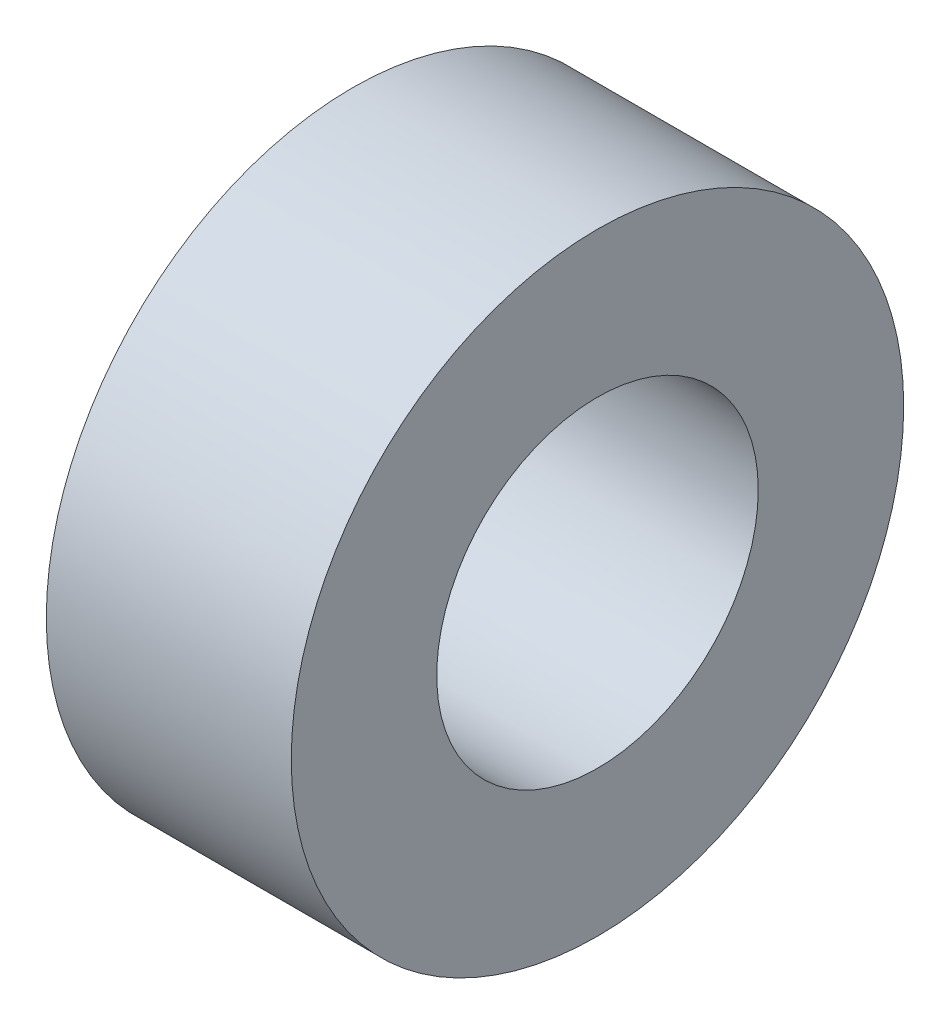
ISO-10303-21;
HEADER;
FILE_DESCRIPTION(('STEP AP214'),'2;1');
FILE_NAME('part.step','',(''),(''),'','','');
FILE_SCHEMA(('AUTOMOTIVE_DESIGN { 1 0 10303 214 1 1 1 1 }'));
ENDSEC;
DATA;
#1=APPLICATION_CONTEXT('core data for automotive mechanical design processes');
#2=APPLICATION_PROTOCOL_DEFINITION('international standard','automotive_design',2000,#1);
#3=PRODUCT_CONTEXT('',#1,'mechanical');
#4=PRODUCT('Part','Part','',(#3));
#5=PRODUCT_RELATED_PRODUCT_CATEGORY('part','',(#4));
#6=PRODUCT_DEFINITION_FORMATION('','',#4);
#7=PRODUCT_DEFINITION_CONTEXT('part definition',#1,'design');
#8=PRODUCT_DEFINITION('design','',#6,#7);
#9=PRODUCT_DEFINITION_SHAPE('','',#8);
#10=(LENGTH_UNIT() NAMED_UNIT(*) SI_UNIT(.MILLI.,.METRE.));
#11=(NAMED_UNIT(*) PLANE_ANGLE_UNIT() SI_UNIT($,.RADIAN.));
#12=(NAMED_UNIT(*) SI_UNIT($,.STERADIAN.) SOLID_ANGLE_UNIT());
#13=UNCERTAINTY_MEASURE_WITH_UNIT(LENGTH_MEASURE(1.E-05),#10,'distance_accuracy_value','');
#14=(GEOMETRIC_REPRESENTATION_CONTEXT(3) GLOBAL_UNCERTAINTY_ASSIGNED_CONTEXT((#13)) GLOBAL_UNIT_ASSIGNED_CONTEXT((#10,
#11,#12)) REPRESENTATION_CONTEXT('',''));
#15=CARTESIAN_POINT('',(0.,0.,0.));
#16=DIRECTION('',(0.,0.,1.));
#17=DIRECTION('',(1.,0.,0.));
#18=AXIS2_PLACEMENT_3D('',#15,#16,#17);
#19=CARTESIAN_POINT('',(0.,0.,-10.));
#20=DIRECTION('',(1.,0.,0.));
#21=DIRECTION('',(0.,0.,-1.));
#22=AXIS2_PLACEMENT_3D('',#19,#20,#21);
#23=PLANE('',#22);
#24=CARTESIAN_POINT('',(0.,0.,-10.));
#25=DIRECTION('',(1.,0.,0.));
#26=DIRECTION('',(0.,0.,-1.));
#27=AXIS2_PLACEMENT_3D('',#24,#25,#26);
#28=CIRCLE('',#27,5.25);
#29=CARTESIAN_POINT('',(0.,0.,-15.25));
#30=VERTEX_POINT('',#29);
#31=EDGE_CURVE('E46',#30,#30,#28,.T.);
#32=ORIENTED_EDGE('',*,*,#31,.T.);
#33=EDGE_LOOP('',(#32));
#34=FACE_BOUND('',#33,.T.);
#35=CARTESIAN_POINT('',(0.,0.,-10.));
#36=DIRECTION('',(1.,0.,0.));
#37=DIRECTION('',(0.,0.,-1.));
#38=AXIS2_PLACEMENT_3D('',#35,#36,#37);
#39=CIRCLE('',#38,10.);
#40=CARTESIAN_POINT('',(0.,0.,-20.));
#41=VERTEX_POINT('',#40);
#42=EDGE_CURVE('E10',#41,#41,#39,.T.);
#43=ORIENTED_EDGE('',*,*,#42,.F.);
#44=EDGE_LOOP('',(#43));
#45=FACE_BOUND('',#44,.T.);
#46=ADVANCED_FACE('F36',(#34,#45),#23,.F.);
#47=CARTESIAN_POINT('',(8.,0.,-10.));
#48=DIRECTION('',(1.,0.,0.));
#49=DIRECTION('',(0.,0.,-1.));
#50=AXIS2_PLACEMENT_3D('',#47,#48,#49);
#51=CYLINDRICAL_SURFACE('',#50,10.);
#52=CARTESIAN_POINT('',(8.,0.,-10.));
#53=DIRECTION('',(1.,0.,0.));
#54=DIRECTION('',(0.,0.,-1.));
#55=AXIS2_PLACEMENT_3D('',#52,#53,#54);
#56=CIRCLE('',#55,10.);
#57=CARTESIAN_POINT('',(8.,0.,-20.));
#58=VERTEX_POINT('',#57);
#59=EDGE_CURVE('E42',#58,#58,#56,.T.);
#60=ORIENTED_EDGE('',*,*,#59,.F.);
#61=EDGE_LOOP('',(#60));
#62=FACE_BOUND('',#61,.T.);
#63=ORIENTED_EDGE('',*,*,#42,.T.);
#64=EDGE_LOOP('',(#63));
#65=FACE_BOUND('',#64,.T.);
#66=ADVANCED_FACE('F61',(#62,#65),#51,.T.);
#67=CARTESIAN_POINT('',(8.,0.,0.));
#68=DIRECTION('',(-1.,0.,0.));
#69=DIRECTION('',(0.,0.,1.));
#70=AXIS2_PLACEMENT_3D('',#67,#68,#69);
#71=PLANE('',#70);
#72=CARTESIAN_POINT('',(8.,0.,-10.));
#73=DIRECTION('',(1.,0.,0.));
#74=DIRECTION('',(0.,0.,-1.));
#75=AXIS2_PLACEMENT_3D('',#72,#73,#74);
#76=CIRCLE('',#75,5.25);
#77=CARTESIAN_POINT('',(8.,0.,-15.25));
#78=VERTEX_POINT('',#77);
#79=EDGE_CURVE('E50',#78,#78,#76,.T.);
#80=ORIENTED_EDGE('',*,*,#79,.F.);
#81=EDGE_LOOP('',(#80));
#82=FACE_BOUND('',#81,.T.);
#83=ORIENTED_EDGE('',*,*,#59,.T.);
#84=EDGE_LOOP('',(#83));
#85=FACE_BOUND('',#84,.T.);
#86=ADVANCED_FACE('F59',(#82,#85),#71,.F.);
#87=CARTESIAN_POINT('',(-2.,0.,-10.));
#88=DIRECTION('',(1.,0.,0.));
#89=DIRECTION('',(0.,0.,-1.));
#90=AXIS2_PLACEMENT_3D('',#87,#88,#89);
#91=CYLINDRICAL_SURFACE('',#90,5.25);
#92=ORIENTED_EDGE('',*,*,#79,.T.);
#93=EDGE_LOOP('',(#92));
#94=FACE_BOUND('',#93,.T.);
#95=ORIENTED_EDGE('',*,*,#31,.F.);
#96=EDGE_LOOP('',(#95));
#97=FACE_BOUND('',#96,.T.);
#98=ADVANCED_FACE('F56',(#94,#97),#91,.F.);
#99=CLOSED_SHELL('',(#46,#66,#86,#98));
#100=MANIFOLD_SOLID_BREP('B2',#99);
#101=ADVANCED_BREP_SHAPE_REPRESENTATION('',(#18,#100),#14);
#102=SHAPE_DEFINITION_REPRESENTATION(#9,#101);
ENDSEC;
END-ISO-10303-21;
